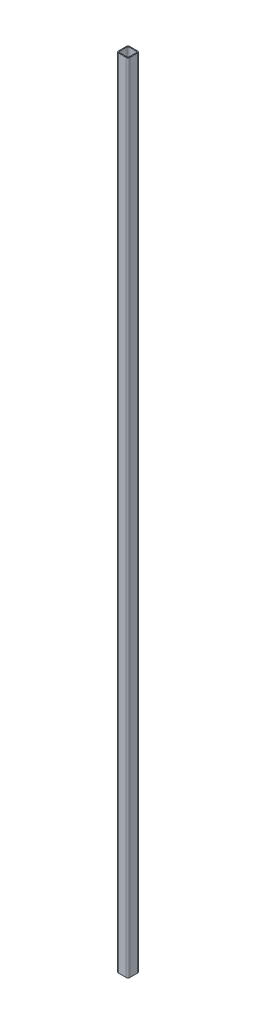
ISO-10303-21;
HEADER;
FILE_DESCRIPTION(('STEP AP214'),'2;1');
FILE_NAME('part.step','',(''),(''),'','','');
FILE_SCHEMA(('AUTOMOTIVE_DESIGN { 1 0 10303 214 1 1 1 1 }'));
ENDSEC;
DATA;
#1=APPLICATION_CONTEXT('core data for automotive mechanical design processes');
#2=APPLICATION_PROTOCOL_DEFINITION('international standard','automotive_design',2000,#1);
#3=PRODUCT_CONTEXT('',#1,'mechanical');
#4=PRODUCT('Part','Part','',(#3));
#5=PRODUCT_RELATED_PRODUCT_CATEGORY('part','',(#4));
#6=PRODUCT_DEFINITION_FORMATION('','',#4);
#7=PRODUCT_DEFINITION_CONTEXT('part definition',#1,'design');
#8=PRODUCT_DEFINITION('design','',#6,#7);
#9=PRODUCT_DEFINITION_SHAPE('','',#8);
#10=(LENGTH_UNIT() NAMED_UNIT(*) SI_UNIT(.MILLI.,.METRE.));
#11=(NAMED_UNIT(*) PLANE_ANGLE_UNIT() SI_UNIT($,.RADIAN.));
#12=(NAMED_UNIT(*) SI_UNIT($,.STERADIAN.) SOLID_ANGLE_UNIT());
#13=UNCERTAINTY_MEASURE_WITH_UNIT(LENGTH_MEASURE(1.E-05),#10,'distance_accuracy_value','');
#14=(GEOMETRIC_REPRESENTATION_CONTEXT(3) GLOBAL_UNCERTAINTY_ASSIGNED_CONTEXT((#13)) GLOBAL_UNIT_ASSIGNED_CONTEXT((#10,
#11,#12)) REPRESENTATION_CONTEXT('',''));
#15=CARTESIAN_POINT('',(0.,0.,0.));
#16=DIRECTION('',(0.,0.,1.));
#17=DIRECTION('',(1.,0.,0.));
#18=AXIS2_PLACEMENT_3D('',#15,#16,#17);
#19=CARTESIAN_POINT('',(1193.6,-1240.,-893.6));
#20=DIRECTION('',(0.,1.,0.));
#21=DIRECTION('',(-1.,0.,0.));
#22=AXIS2_PLACEMENT_3D('',#19,#20,#21);
#23=CYLINDRICAL_SURFACE('',#22,6.39999999999996);
#24=CARTESIAN_POINT('',(1193.6,1565.,-893.6));
#25=DIRECTION('',(0.,1.,0.));
#26=DIRECTION('',(-1.,0.,0.));
#27=AXIS2_PLACEMENT_3D('',#24,#25,#26);
#28=CIRCLE('',#27,6.39999999999996);
#29=CARTESIAN_POINT('',(1193.6,1565.,-900.));
#30=VERTEX_POINT('',#29);
#31=CARTESIAN_POINT('',(1200.,1565.,-893.6));
#32=VERTEX_POINT('',#31);
#33=EDGE_CURVE('E147',#30,#32,#28,.F.);
#34=ORIENTED_EDGE('',*,*,#33,.T.);
#35=DIRECTION('',(0.,-1.,0.));
#36=VECTOR('',#35,1.);
#37=CARTESIAN_POINT('',(1200.,-1240.,-893.6));
#38=LINE('',#37,#36);
#39=CARTESIAN_POINT('',(1200.,-1240.,-893.6));
#40=VERTEX_POINT('',#39);
#41=EDGE_CURVE('E138',#32,#40,#38,.T.);
#42=ORIENTED_EDGE('',*,*,#41,.T.);
#43=CARTESIAN_POINT('',(1193.6,-1240.,-893.6));
#44=DIRECTION('',(0.,1.,0.));
#45=DIRECTION('',(-1.,0.,0.));
#46=AXIS2_PLACEMENT_3D('',#43,#44,#45);
#47=CIRCLE('',#46,6.39999999999996);
#48=CARTESIAN_POINT('',(1193.6,-1240.,-900.));
#49=VERTEX_POINT('',#48);
#50=EDGE_CURVE('E242',#49,#40,#47,.F.);
#51=ORIENTED_EDGE('',*,*,#50,.F.);
#52=DIRECTION('',(0.,-1.,0.));
#53=VECTOR('',#52,1.);
#54=CARTESIAN_POINT('',(1193.6,-1240.,-900.));
#55=LINE('',#54,#53);
#56=EDGE_CURVE('E137',#49,#30,#55,.F.);
#57=ORIENTED_EDGE('',*,*,#56,.T.);
#58=EDGE_LOOP('',(#34,#42,#51,#57));
#59=FACE_BOUND('',#58,.T.);
#60=ADVANCED_FACE('F19',(#59),#23,.T.);
#61=CARTESIAN_POINT('',(1200.,-1240.,-866.400000000001));
#62=DIRECTION('',(-1.,0.,0.));
#63=DIRECTION('',(0.,-1.,0.));
#64=AXIS2_PLACEMENT_3D('',#61,#62,#63);
#65=PLANE('',#64);
#66=DIRECTION('',(0.,0.,-1.));
#67=VECTOR('',#66,1.);
#68=CARTESIAN_POINT('',(1200.,-1240.,-866.4));
#69=LINE('',#68,#67);
#70=CARTESIAN_POINT('',(1200.,-1240.,-866.4));
#71=VERTEX_POINT('',#70);
#72=EDGE_CURVE('E241',#40,#71,#69,.F.);
#73=ORIENTED_EDGE('',*,*,#72,.F.);
#74=ORIENTED_EDGE('',*,*,#41,.F.);
#75=DIRECTION('',(0.,0.,-1.));
#76=VECTOR('',#75,1.);
#77=CARTESIAN_POINT('',(1200.,1565.,-895.4));
#78=LINE('',#77,#76);
#79=CARTESIAN_POINT('',(1200.,1565.,-866.4));
#80=VERTEX_POINT('',#79);
#81=EDGE_CURVE('E275',#32,#80,#78,.F.);
#82=ORIENTED_EDGE('',*,*,#81,.T.);
#83=DIRECTION('',(0.,1.,0.));
#84=VECTOR('',#83,1.);
#85=CARTESIAN_POINT('',(1200.,-1240.,-866.400000000001));
#86=LINE('',#85,#84);
#87=EDGE_CURVE('E185',#71,#80,#86,.T.);
#88=ORIENTED_EDGE('',*,*,#87,.F.);
#89=EDGE_LOOP('',(#73,#74,#82,#88));
#90=FACE_BOUND('',#89,.T.);
#91=ADVANCED_FACE('F282',(#90),#65,.F.);
#92=CARTESIAN_POINT('',(1166.4,-1240.,-893.6));
#93=DIRECTION('',(0.,1.,0.));
#94=DIRECTION('',(-1.,0.,0.));
#95=AXIS2_PLACEMENT_3D('',#92,#93,#94);
#96=CYLINDRICAL_SURFACE('',#95,6.39999999999996);
#97=CARTESIAN_POINT('',(1166.4,1565.,-893.6));
#98=DIRECTION('',(0.,1.,0.));
#99=DIRECTION('',(-1.,0.,0.));
#100=AXIS2_PLACEMENT_3D('',#97,#98,#99);
#101=CIRCLE('',#100,6.39999999999996);
#102=CARTESIAN_POINT('',(1160.,1565.,-893.6));
#103=VERTEX_POINT('',#102);
#104=CARTESIAN_POINT('',(1166.4,1565.,-900.));
#105=VERTEX_POINT('',#104);
#106=EDGE_CURVE('E22',#103,#105,#101,.F.);
#107=ORIENTED_EDGE('',*,*,#106,.T.);
#108=DIRECTION('',(0.,-1.,0.));
#109=VECTOR('',#108,1.);
#110=CARTESIAN_POINT('',(1166.4,-1240.,-900.));
#111=LINE('',#110,#109);
#112=CARTESIAN_POINT('',(1166.4,-1240.,-900.));
#113=VERTEX_POINT('',#112);
#114=EDGE_CURVE('E131',#105,#113,#111,.T.);
#115=ORIENTED_EDGE('',*,*,#114,.T.);
#116=CARTESIAN_POINT('',(1166.4,-1240.,-893.6));
#117=DIRECTION('',(0.,1.,0.));
#118=DIRECTION('',(-1.,0.,0.));
#119=AXIS2_PLACEMENT_3D('',#116,#117,#118);
#120=CIRCLE('',#119,6.39999999999996);
#121=CARTESIAN_POINT('',(1160.,-1240.,-893.6));
#122=VERTEX_POINT('',#121);
#123=EDGE_CURVE('E237',#122,#113,#120,.F.);
#124=ORIENTED_EDGE('',*,*,#123,.F.);
#125=DIRECTION('',(0.,1.,0.));
#126=VECTOR('',#125,1.);
#127=CARTESIAN_POINT('',(1160.,-1240.,-893.6));
#128=LINE('',#127,#126);
#129=EDGE_CURVE('E124',#122,#103,#128,.T.);
#130=ORIENTED_EDGE('',*,*,#129,.T.);
#131=EDGE_LOOP('',(#107,#115,#124,#130));
#132=FACE_BOUND('',#131,.T.);
#133=ADVANCED_FACE('F149',(#132),#96,.T.);
#134=CARTESIAN_POINT('',(1166.4,-1240.,-900.));
#135=DIRECTION('',(0.,0.,1.));
#136=DIRECTION('',(0.,-1.,0.));
#137=AXIS2_PLACEMENT_3D('',#134,#135,#136);
#138=PLANE('',#137);
#139=DIRECTION('',(1.,0.,0.));
#140=VECTOR('',#139,1.);
#141=CARTESIAN_POINT('',(1193.6,-1240.,-900.));
#142=LINE('',#141,#140);
#143=EDGE_CURVE('E136',#113,#49,#142,.T.);
#144=ORIENTED_EDGE('',*,*,#143,.F.);
#145=ORIENTED_EDGE('',*,*,#114,.F.);
#146=DIRECTION('',(1.,0.,0.));
#147=VECTOR('',#146,1.);
#148=CARTESIAN_POINT('',(1164.6,1565.,-900.));
#149=LINE('',#148,#147);
#150=EDGE_CURVE('E134',#105,#30,#149,.T.);
#151=ORIENTED_EDGE('',*,*,#150,.T.);
#152=ORIENTED_EDGE('',*,*,#56,.F.);
#153=EDGE_LOOP('',(#144,#145,#151,#152));
#154=FACE_BOUND('',#153,.T.);
#155=ADVANCED_FACE('F133',(#154),#138,.F.);
#156=CARTESIAN_POINT('',(1166.4,-1240.,-893.6));
#157=DIRECTION('',(0.,1.,0.));
#158=DIRECTION('',(-1.,0.,0.));
#159=AXIS2_PLACEMENT_3D('',#156,#157,#158);
#160=CYLINDRICAL_SURFACE('',#159,3.19999999999987);
#161=CARTESIAN_POINT('',(1166.4,-1240.,-893.6));
#162=DIRECTION('',(0.,1.,0.));
#163=DIRECTION('',(-1.,0.,0.));
#164=AXIS2_PLACEMENT_3D('',#161,#162,#163);
#165=CIRCLE('',#164,3.19999999999987);
#166=CARTESIAN_POINT('',(1166.4,-1240.,-896.8));
#167=VERTEX_POINT('',#166);
#168=CARTESIAN_POINT('',(1163.2,-1240.,-893.6));
#169=VERTEX_POINT('',#168);
#170=EDGE_CURVE('E261',#167,#169,#165,.T.);
#171=ORIENTED_EDGE('',*,*,#170,.F.);
#172=DIRECTION('',(0.,-1.,0.));
#173=VECTOR('',#172,1.);
#174=CARTESIAN_POINT('',(1166.4,-1240.,-896.8));
#175=LINE('',#174,#173);
#176=CARTESIAN_POINT('',(1166.4,1565.,-896.8));
#177=VERTEX_POINT('',#176);
#178=EDGE_CURVE('E154',#177,#167,#175,.T.);
#179=ORIENTED_EDGE('',*,*,#178,.F.);
#180=CARTESIAN_POINT('',(1166.4,1565.,-893.6));
#181=DIRECTION('',(0.,1.,0.));
#182=DIRECTION('',(-1.,0.,0.));
#183=AXIS2_PLACEMENT_3D('',#180,#181,#182);
#184=CIRCLE('',#183,3.19999999999987);
#185=CARTESIAN_POINT('',(1163.2,1565.,-893.6));
#186=VERTEX_POINT('',#185);
#187=EDGE_CURVE('E216',#177,#186,#184,.T.);
#188=ORIENTED_EDGE('',*,*,#187,.T.);
#189=DIRECTION('',(0.,1.,0.));
#190=VECTOR('',#189,1.);
#191=CARTESIAN_POINT('',(1163.2,-1240.,-893.6));
#192=LINE('',#191,#190);
#193=EDGE_CURVE('E177',#169,#186,#192,.T.);
#194=ORIENTED_EDGE('',*,*,#193,.F.);
#195=EDGE_LOOP('',(#171,#179,#188,#194));
#196=FACE_BOUND('',#195,.T.);
#197=ADVANCED_FACE('F403',(#196),#160,.F.);
#198=CARTESIAN_POINT('',(1163.2,-1240.,-893.6));
#199=DIRECTION('',(1.,0.,0.));
#200=DIRECTION('',(0.,1.,0.));
#201=AXIS2_PLACEMENT_3D('',#198,#199,#200);
#202=PLANE('',#201);
#203=DIRECTION('',(0.,0.,-1.));
#204=VECTOR('',#203,1.);
#205=CARTESIAN_POINT('',(1163.2,1565.,-895.4));
#206=LINE('',#205,#204);
#207=CARTESIAN_POINT('',(1163.2,1565.,-866.400000000001));
#208=VERTEX_POINT('',#207);
#209=EDGE_CURVE('E188',#186,#208,#206,.F.);
#210=ORIENTED_EDGE('',*,*,#209,.T.);
#211=DIRECTION('',(0.,1.,0.));
#212=VECTOR('',#211,1.);
#213=CARTESIAN_POINT('',(1163.2,-1240.,-866.400000000001));
#214=LINE('',#213,#212);
#215=CARTESIAN_POINT('',(1163.2,-1240.,-866.400000000001));
#216=VERTEX_POINT('',#215);
#217=EDGE_CURVE('E174',#208,#216,#214,.F.);
#218=ORIENTED_EDGE('',*,*,#217,.T.);
#219=DIRECTION('',(0.,0.,-1.));
#220=VECTOR('',#219,1.);
#221=CARTESIAN_POINT('',(1163.2,-1240.,-866.4));
#222=LINE('',#221,#220);
#223=EDGE_CURVE('E453',#169,#216,#222,.F.);
#224=ORIENTED_EDGE('',*,*,#223,.F.);
#225=ORIENTED_EDGE('',*,*,#193,.T.);
#226=EDGE_LOOP('',(#210,#218,#224,#225));
#227=FACE_BOUND('',#226,.T.);
#228=ADVANCED_FACE('F393',(#227),#202,.T.);
#229=CARTESIAN_POINT('',(1166.4,-1240.,-866.400000000001));
#230=DIRECTION('',(0.,1.,0.));
#231=DIRECTION('',(-1.,0.,0.));
#232=AXIS2_PLACEMENT_3D('',#229,#230,#231);
#233=CYLINDRICAL_SURFACE('',#232,3.19999999999987);
#234=CARTESIAN_POINT('',(1166.4,-1240.,-866.400000000001));
#235=DIRECTION('',(0.,1.,0.));
#236=DIRECTION('',(-1.,0.,0.));
#237=AXIS2_PLACEMENT_3D('',#234,#235,#236);
#238=CIRCLE('',#237,3.19999999999987);
#239=CARTESIAN_POINT('',(1166.4,-1240.,-863.2));
#240=VERTEX_POINT('',#239);
#241=EDGE_CURVE('E454',#216,#240,#238,.T.);
#242=ORIENTED_EDGE('',*,*,#241,.F.);
#243=ORIENTED_EDGE('',*,*,#217,.F.);
#244=CARTESIAN_POINT('',(1166.4,1565.,-866.400000000001));
#245=DIRECTION('',(0.,1.,0.));
#246=DIRECTION('',(-1.,0.,0.));
#247=AXIS2_PLACEMENT_3D('',#244,#245,#246);
#248=CIRCLE('',#247,3.19999999999987);
#249=CARTESIAN_POINT('',(1166.4,1565.,-863.2));
#250=VERTEX_POINT('',#249);
#251=EDGE_CURVE('E273',#208,#250,#248,.T.);
#252=ORIENTED_EDGE('',*,*,#251,.T.);
#253=DIRECTION('',(0.,1.,0.));
#254=VECTOR('',#253,1.);
#255=CARTESIAN_POINT('',(1166.4,-1240.,-863.2));
#256=LINE('',#255,#254);
#257=EDGE_CURVE('E172',#240,#250,#256,.T.);
#258=ORIENTED_EDGE('',*,*,#257,.F.);
#259=EDGE_LOOP('',(#242,#243,#252,#258));
#260=FACE_BOUND('',#259,.T.);
#261=ADVANCED_FACE('F383',(#260),#233,.F.);
#262=CARTESIAN_POINT('',(1193.6,-1240.,-863.2));
#263=DIRECTION('',(0.,0.,-1.));
#264=DIRECTION('',(0.,1.,0.));
#265=AXIS2_PLACEMENT_3D('',#262,#263,#264);
#266=PLANE('',#265);
#267=DIRECTION('',(1.,0.,0.));
#268=VECTOR('',#267,1.);
#269=CARTESIAN_POINT('',(1164.6,1565.,-863.2));
#270=LINE('',#269,#268);
#271=CARTESIAN_POINT('',(1193.6,1565.,-863.2));
#272=VERTEX_POINT('',#271);
#273=EDGE_CURVE('E226',#250,#272,#270,.T.);
#274=ORIENTED_EDGE('',*,*,#273,.T.);
#275=DIRECTION('',(0.,1.,0.));
#276=VECTOR('',#275,1.);
#277=CARTESIAN_POINT('',(1193.6,-1240.,-863.2));
#278=LINE('',#277,#276);
#279=CARTESIAN_POINT('',(1193.6,-1240.,-863.2));
#280=VERTEX_POINT('',#279);
#281=EDGE_CURVE('E169',#272,#280,#278,.F.);
#282=ORIENTED_EDGE('',*,*,#281,.T.);
#283=DIRECTION('',(1.,0.,0.));
#284=VECTOR('',#283,1.);
#285=CARTESIAN_POINT('',(1193.6,-1240.,-863.2));
#286=LINE('',#285,#284);
#287=EDGE_CURVE('E455',#240,#280,#286,.T.);
#288=ORIENTED_EDGE('',*,*,#287,.F.);
#289=ORIENTED_EDGE('',*,*,#257,.T.);
#290=EDGE_LOOP('',(#274,#282,#288,#289));
#291=FACE_BOUND('',#290,.T.);
#292=ADVANCED_FACE('F373',(#291),#266,.T.);
#293=CARTESIAN_POINT('',(1193.6,-1240.,-866.4));
#294=DIRECTION('',(0.,1.,0.));
#295=DIRECTION('',(-1.,0.,0.));
#296=AXIS2_PLACEMENT_3D('',#293,#294,#295);
#297=CYLINDRICAL_SURFACE('',#296,3.19999999999987);
#298=CARTESIAN_POINT('',(1193.6,-1240.,-866.4));
#299=DIRECTION('',(0.,1.,0.));
#300=DIRECTION('',(-1.,0.,0.));
#301=AXIS2_PLACEMENT_3D('',#298,#299,#300);
#302=CIRCLE('',#301,3.19999999999987);
#303=CARTESIAN_POINT('',(1196.8,-1240.,-866.4));
#304=VERTEX_POINT('',#303);
#305=EDGE_CURVE('E201',#280,#304,#302,.T.);
#306=ORIENTED_EDGE('',*,*,#305,.F.);
#307=ORIENTED_EDGE('',*,*,#281,.F.);
#308=CARTESIAN_POINT('',(1193.6,1565.,-866.4));
#309=DIRECTION('',(0.,1.,0.));
#310=DIRECTION('',(-1.,0.,0.));
#311=AXIS2_PLACEMENT_3D('',#308,#309,#310);
#312=CIRCLE('',#311,3.19999999999987);
#313=CARTESIAN_POINT('',(1196.8,1565.,-866.4));
#314=VERTEX_POINT('',#313);
#315=EDGE_CURVE('E225',#272,#314,#312,.T.);
#316=ORIENTED_EDGE('',*,*,#315,.T.);
#317=DIRECTION('',(0.,-1.,0.));
#318=VECTOR('',#317,1.);
#319=CARTESIAN_POINT('',(1196.8,-1240.,-866.4));
#320=LINE('',#319,#318);
#321=EDGE_CURVE('E167',#304,#314,#320,.F.);
#322=ORIENTED_EDGE('',*,*,#321,.F.);
#323=EDGE_LOOP('',(#306,#307,#316,#322));
#324=FACE_BOUND('',#323,.T.);
#325=ADVANCED_FACE('F363',(#324),#297,.F.);
#326=CARTESIAN_POINT('',(1196.8,-1240.,-866.4));
#327=DIRECTION('',(-1.,0.,0.));
#328=DIRECTION('',(0.,-1.,0.));
#329=AXIS2_PLACEMENT_3D('',#326,#327,#328);
#330=PLANE('',#329);
#331=DIRECTION('',(0.,0.,-1.));
#332=VECTOR('',#331,1.);
#333=CARTESIAN_POINT('',(1196.8,1565.,-895.4));
#334=LINE('',#333,#332);
#335=CARTESIAN_POINT('',(1196.8,1565.,-893.6));
#336=VERTEX_POINT('',#335);
#337=EDGE_CURVE('E221',#314,#336,#334,.T.);
#338=ORIENTED_EDGE('',*,*,#337,.T.);
#339=DIRECTION('',(0.,1.,0.));
#340=VECTOR('',#339,1.);
#341=CARTESIAN_POINT('',(1196.8,-1240.,-893.6));
#342=LINE('',#341,#340);
#343=CARTESIAN_POINT('',(1196.8,-1240.,-893.6));
#344=VERTEX_POINT('',#343);
#345=EDGE_CURVE('E163',#336,#344,#342,.F.);
#346=ORIENTED_EDGE('',*,*,#345,.T.);
#347=DIRECTION('',(0.,0.,-1.));
#348=VECTOR('',#347,1.);
#349=CARTESIAN_POINT('',(1196.8,-1240.,-866.4));
#350=LINE('',#349,#348);
#351=EDGE_CURVE('E200',#304,#344,#350,.T.);
#352=ORIENTED_EDGE('',*,*,#351,.F.);
#353=ORIENTED_EDGE('',*,*,#321,.T.);
#354=EDGE_LOOP('',(#338,#346,#352,#353));
#355=FACE_BOUND('',#354,.T.);
#356=ADVANCED_FACE('F353',(#355),#330,.T.);
#357=CARTESIAN_POINT('',(1193.6,-1240.,-893.6));
#358=DIRECTION('',(0.,1.,0.));
#359=DIRECTION('',(-1.,0.,0.));
#360=AXIS2_PLACEMENT_3D('',#357,#358,#359);
#361=CYLINDRICAL_SURFACE('',#360,3.19999999999987);
#362=CARTESIAN_POINT('',(1193.6,-1240.,-893.6));
#363=DIRECTION('',(0.,1.,0.));
#364=DIRECTION('',(-1.,0.,0.));
#365=AXIS2_PLACEMENT_3D('',#362,#363,#364);
#366=CIRCLE('',#365,3.19999999999987);
#367=CARTESIAN_POINT('',(1193.6,-1240.,-896.8));
#368=VERTEX_POINT('',#367);
#369=EDGE_CURVE('E197',#344,#368,#366,.T.);
#370=ORIENTED_EDGE('',*,*,#369,.F.);
#371=ORIENTED_EDGE('',*,*,#345,.F.);
#372=CARTESIAN_POINT('',(1193.6,1565.,-893.6));
#373=DIRECTION('',(0.,1.,0.));
#374=DIRECTION('',(-1.,0.,0.));
#375=AXIS2_PLACEMENT_3D('',#372,#373,#374);
#376=CIRCLE('',#375,3.19999999999987);
#377=CARTESIAN_POINT('',(1193.6,1565.,-896.8));
#378=VERTEX_POINT('',#377);
#379=EDGE_CURVE('E220',#336,#378,#376,.T.);
#380=ORIENTED_EDGE('',*,*,#379,.T.);
#381=DIRECTION('',(0.,-1.,0.));
#382=VECTOR('',#381,1.);
#383=CARTESIAN_POINT('',(1193.6,-1240.,-896.8));
#384=LINE('',#383,#382);
#385=EDGE_CURVE('E161',#368,#378,#384,.F.);
#386=ORIENTED_EDGE('',*,*,#385,.F.);
#387=EDGE_LOOP('',(#370,#371,#380,#386));
#388=FACE_BOUND('',#387,.T.);
#389=ADVANCED_FACE('F343',(#388),#361,.F.);
#390=CARTESIAN_POINT('',(1166.4,-1240.,-896.8));
#391=DIRECTION('',(0.,0.,1.));
#392=DIRECTION('',(0.,-1.,0.));
#393=AXIS2_PLACEMENT_3D('',#390,#391,#392);
#394=PLANE('',#393);
#395=DIRECTION('',(1.,0.,0.));
#396=VECTOR('',#395,1.);
#397=CARTESIAN_POINT('',(1164.6,1565.,-896.8));
#398=LINE('',#397,#396);
#399=EDGE_CURVE('E217',#378,#177,#398,.F.);
#400=ORIENTED_EDGE('',*,*,#399,.T.);
#401=ORIENTED_EDGE('',*,*,#178,.T.);
#402=DIRECTION('',(1.,0.,0.));
#403=VECTOR('',#402,1.);
#404=CARTESIAN_POINT('',(1193.6,-1240.,-896.8));
#405=LINE('',#404,#403);
#406=EDGE_CURVE('E196',#368,#167,#405,.F.);
#407=ORIENTED_EDGE('',*,*,#406,.F.);
#408=ORIENTED_EDGE('',*,*,#385,.T.);
#409=EDGE_LOOP('',(#400,#401,#407,#408));
#410=FACE_BOUND('',#409,.T.);
#411=ADVANCED_FACE('F334',(#410),#394,.T.);
#412=CARTESIAN_POINT('',(1160.,-1240.,-893.6));
#413=DIRECTION('',(1.,0.,0.));
#414=DIRECTION('',(0.,1.,0.));
#415=AXIS2_PLACEMENT_3D('',#412,#413,#414);
#416=PLANE('',#415);
#417=DIRECTION('',(0.,0.,-1.));
#418=VECTOR('',#417,1.);
#419=CARTESIAN_POINT('',(1160.,-1240.,-866.4));
#420=LINE('',#419,#418);
#421=CARTESIAN_POINT('',(1160.,-1240.,-866.400000000001));
#422=VERTEX_POINT('',#421);
#423=EDGE_CURVE('E233',#422,#122,#420,.T.);
#424=ORIENTED_EDGE('',*,*,#423,.F.);
#425=DIRECTION('',(0.,1.,0.));
#426=VECTOR('',#425,1.);
#427=CARTESIAN_POINT('',(1160.,-1240.,-866.400000000001));
#428=LINE('',#427,#426);
#429=CARTESIAN_POINT('',(1160.,1565.,-866.400000000001));
#430=VERTEX_POINT('',#429);
#431=EDGE_CURVE('E157',#430,#422,#428,.F.);
#432=ORIENTED_EDGE('',*,*,#431,.F.);
#433=DIRECTION('',(0.,0.,-1.));
#434=VECTOR('',#433,1.);
#435=CARTESIAN_POINT('',(1160.,1565.,-895.4));
#436=LINE('',#435,#434);
#437=EDGE_CURVE('E150',#430,#103,#436,.T.);
#438=ORIENTED_EDGE('',*,*,#437,.T.);
#439=ORIENTED_EDGE('',*,*,#129,.F.);
#440=EDGE_LOOP('',(#424,#432,#438,#439));
#441=FACE_BOUND('',#440,.T.);
#442=ADVANCED_FACE('F259',(#441),#416,.F.);
#443=CARTESIAN_POINT('',(1164.6,1565.,-895.4));
#444=DIRECTION('',(0.,-1.,0.));
#445=DIRECTION('',(0.,0.,-1.));
#446=AXIS2_PLACEMENT_3D('',#443,#444,#445);
#447=PLANE('',#446);
#448=ORIENTED_EDGE('',*,*,#187,.F.);
#449=ORIENTED_EDGE('',*,*,#399,.F.);
#450=ORIENTED_EDGE('',*,*,#379,.F.);
#451=ORIENTED_EDGE('',*,*,#337,.F.);
#452=ORIENTED_EDGE('',*,*,#315,.F.);
#453=ORIENTED_EDGE('',*,*,#273,.F.);
#454=ORIENTED_EDGE('',*,*,#251,.F.);
#455=ORIENTED_EDGE('',*,*,#209,.F.);
#456=EDGE_LOOP('',(#448,#449,#450,#451,#452,#453,#454,#455));
#457=FACE_BOUND('',#456,.T.);
#458=ORIENTED_EDGE('',*,*,#33,.F.);
#459=ORIENTED_EDGE('',*,*,#150,.F.);
#460=ORIENTED_EDGE('',*,*,#106,.F.);
#461=ORIENTED_EDGE('',*,*,#437,.F.);
#462=CARTESIAN_POINT('',(1166.4,1565.,-866.400000000001));
#463=DIRECTION('',(0.,1.,0.));
#464=DIRECTION('',(-1.,0.,0.));
#465=AXIS2_PLACEMENT_3D('',#462,#463,#464);
#466=CIRCLE('',#465,6.39999999999996);
#467=CARTESIAN_POINT('',(1166.4,1565.,-860.));
#468=VERTEX_POINT('',#467);
#469=EDGE_CURVE('E160',#468,#430,#466,.F.);
#470=ORIENTED_EDGE('',*,*,#469,.F.);
#471=DIRECTION('',(1.,0.,0.));
#472=VECTOR('',#471,1.);
#473=CARTESIAN_POINT('',(1193.6,1565.,-860.));
#474=LINE('',#473,#472);
#475=CARTESIAN_POINT('',(1193.6,1565.,-860.));
#476=VERTEX_POINT('',#475);
#477=EDGE_CURVE('E159',#468,#476,#474,.T.);
#478=ORIENTED_EDGE('',*,*,#477,.T.);
#479=CARTESIAN_POINT('',(1193.6,1565.,-866.4));
#480=DIRECTION('',(0.,1.,0.));
#481=DIRECTION('',(-1.,0.,0.));
#482=AXIS2_PLACEMENT_3D('',#479,#480,#481);
#483=CIRCLE('',#482,6.39999999999996);
#484=EDGE_CURVE('E187',#80,#476,#483,.F.);
#485=ORIENTED_EDGE('',*,*,#484,.F.);
#486=ORIENTED_EDGE('',*,*,#81,.F.);
#487=EDGE_LOOP('',(#458,#459,#460,#461,#470,#478,#485,#486));
#488=FACE_BOUND('',#487,.T.);
#489=ADVANCED_FACE('F142',(#457,#488),#447,.F.);
#490=CARTESIAN_POINT('',(1193.6,-1240.,-866.4));
#491=DIRECTION('',(0.,1.,0.));
#492=DIRECTION('',(-1.,0.,0.));
#493=AXIS2_PLACEMENT_3D('',#490,#491,#492);
#494=CYLINDRICAL_SURFACE('',#493,6.39999999999996);
#495=ORIENTED_EDGE('',*,*,#484,.T.);
#496=DIRECTION('',(0.,1.,0.));
#497=VECTOR('',#496,1.);
#498=CARTESIAN_POINT('',(1193.6,-1240.,-860.));
#499=LINE('',#498,#497);
#500=CARTESIAN_POINT('',(1193.6,-1240.,-860.));
#501=VERTEX_POINT('',#500);
#502=EDGE_CURVE('E213',#476,#501,#499,.F.);
#503=ORIENTED_EDGE('',*,*,#502,.T.);
#504=CARTESIAN_POINT('',(1193.6,-1240.,-866.4));
#505=DIRECTION('',(0.,1.,0.));
#506=DIRECTION('',(-1.,0.,0.));
#507=AXIS2_PLACEMENT_3D('',#504,#505,#506);
#508=CIRCLE('',#507,6.39999999999996);
#509=EDGE_CURVE('E238',#71,#501,#508,.F.);
#510=ORIENTED_EDGE('',*,*,#509,.F.);
#511=ORIENTED_EDGE('',*,*,#87,.T.);
#512=EDGE_LOOP('',(#495,#503,#510,#511));
#513=FACE_BOUND('',#512,.T.);
#514=ADVANCED_FACE('F283',(#513),#494,.T.);
#515=CARTESIAN_POINT('',(1193.6,-1240.,-866.4));
#516=DIRECTION('',(0.,-1.,0.));
#517=DIRECTION('',(0.,0.,-1.));
#518=AXIS2_PLACEMENT_3D('',#515,#516,#517);
#519=PLANE('',#518);
#520=ORIENTED_EDGE('',*,*,#369,.T.);
#521=ORIENTED_EDGE('',*,*,#406,.T.);
#522=ORIENTED_EDGE('',*,*,#170,.T.);
#523=ORIENTED_EDGE('',*,*,#223,.T.);
#524=ORIENTED_EDGE('',*,*,#241,.T.);
#525=ORIENTED_EDGE('',*,*,#287,.T.);
#526=ORIENTED_EDGE('',*,*,#305,.T.);
#527=ORIENTED_EDGE('',*,*,#351,.T.);
#528=EDGE_LOOP('',(#520,#521,#522,#523,#524,#525,#526,#527));
#529=FACE_BOUND('',#528,.T.);
#530=ORIENTED_EDGE('',*,*,#123,.T.);
#531=ORIENTED_EDGE('',*,*,#143,.T.);
#532=ORIENTED_EDGE('',*,*,#50,.T.);
#533=ORIENTED_EDGE('',*,*,#72,.T.);
#534=ORIENTED_EDGE('',*,*,#509,.T.);
#535=DIRECTION('',(1.,0.,0.));
#536=VECTOR('',#535,1.);
#537=CARTESIAN_POINT('',(1193.6,-1240.,-860.));
#538=LINE('',#537,#536);
#539=CARTESIAN_POINT('',(1166.4,-1240.,-860.));
#540=VERTEX_POINT('',#539);
#541=EDGE_CURVE('E28',#501,#540,#538,.F.);
#542=ORIENTED_EDGE('',*,*,#541,.T.);
#543=CARTESIAN_POINT('',(1166.4,-1240.,-866.400000000001));
#544=DIRECTION('',(0.,1.,0.));
#545=DIRECTION('',(-1.,0.,0.));
#546=AXIS2_PLACEMENT_3D('',#543,#544,#545);
#547=CIRCLE('',#546,6.39999999999996);
#548=EDGE_CURVE('E36',#422,#540,#547,.T.);
#549=ORIENTED_EDGE('',*,*,#548,.F.);
#550=ORIENTED_EDGE('',*,*,#423,.T.);
#551=EDGE_LOOP('',(#530,#531,#532,#533,#534,#542,#549,#550));
#552=FACE_BOUND('',#551,.T.);
#553=ADVANCED_FACE('F250',(#529,#552),#519,.T.);
#554=CARTESIAN_POINT('',(1166.4,-1240.,-866.400000000001));
#555=DIRECTION('',(0.,1.,0.));
#556=DIRECTION('',(-1.,0.,0.));
#557=AXIS2_PLACEMENT_3D('',#554,#555,#556);
#558=CYLINDRICAL_SURFACE('',#557,6.39999999999996);
#559=ORIENTED_EDGE('',*,*,#469,.T.);
#560=ORIENTED_EDGE('',*,*,#431,.T.);
#561=ORIENTED_EDGE('',*,*,#548,.T.);
#562=DIRECTION('',(0.,1.,0.));
#563=VECTOR('',#562,1.);
#564=CARTESIAN_POINT('',(1166.4,-1240.,-860.));
#565=LINE('',#564,#563);
#566=EDGE_CURVE('E12',#540,#468,#565,.T.);
#567=ORIENTED_EDGE('',*,*,#566,.T.);
#568=EDGE_LOOP('',(#559,#560,#561,#567));
#569=FACE_BOUND('',#568,.T.);
#570=ADVANCED_FACE('F255',(#569),#558,.T.);
#571=CARTESIAN_POINT('',(1193.6,-1240.,-860.));
#572=DIRECTION('',(0.,0.,-1.));
#573=DIRECTION('',(0.,1.,0.));
#574=AXIS2_PLACEMENT_3D('',#571,#572,#573);
#575=PLANE('',#574);
#576=ORIENTED_EDGE('',*,*,#541,.F.);
#577=ORIENTED_EDGE('',*,*,#502,.F.);
#578=ORIENTED_EDGE('',*,*,#477,.F.);
#579=ORIENTED_EDGE('',*,*,#566,.F.);
#580=EDGE_LOOP('',(#576,#577,#578,#579));
#581=FACE_BOUND('',#580,.T.);
#582=ADVANCED_FACE('F252',(#581),#575,.F.);
#583=CLOSED_SHELL('',(#60,#91,#133,#155,#197,#228,#261,#292,#325,#356,#389,#411,#442,#489,#514,
#553,#570,#582));
#584=MANIFOLD_SOLID_BREP('B1',#583);
#585=ADVANCED_BREP_SHAPE_REPRESENTATION('',(#18,#584),#14);
#586=SHAPE_DEFINITION_REPRESENTATION(#9,#585);
ENDSEC;
END-ISO-10303-21;
